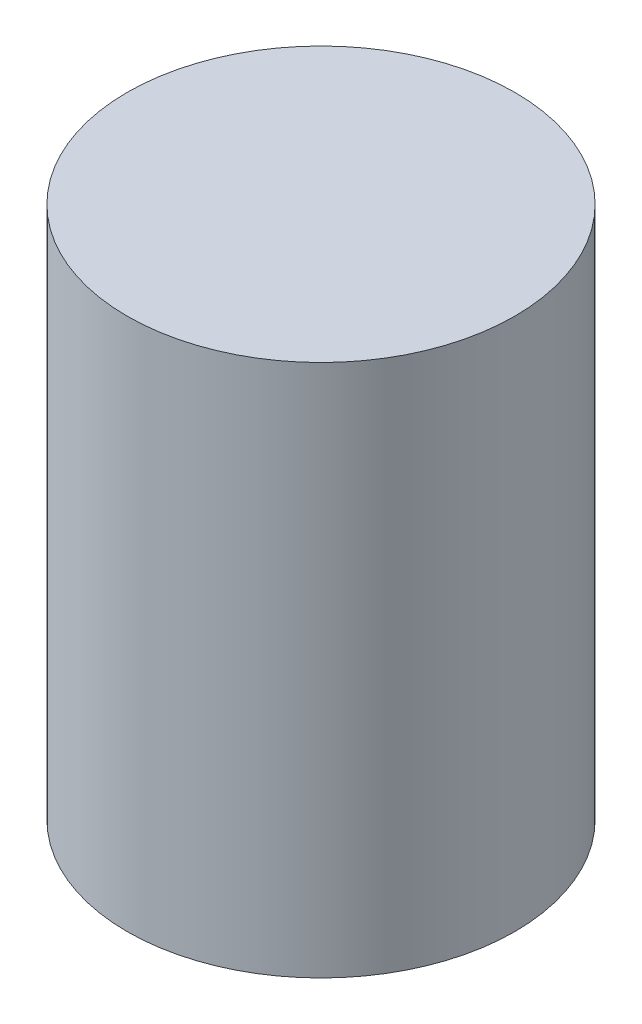
ISO-10303-21;
HEADER;
FILE_DESCRIPTION(('STEP AP214'),'2;1');
FILE_NAME('part.step','',(''),(''),'','','');
FILE_SCHEMA(('AUTOMOTIVE_DESIGN { 1 0 10303 214 1 1 1 1 }'));
ENDSEC;
DATA;
#1=APPLICATION_CONTEXT('core data for automotive mechanical design processes');
#2=APPLICATION_PROTOCOL_DEFINITION('international standard','automotive_design',2000,#1);
#3=PRODUCT_CONTEXT('',#1,'mechanical');
#4=PRODUCT('Part','Part','',(#3));
#5=PRODUCT_RELATED_PRODUCT_CATEGORY('part','',(#4));
#6=PRODUCT_DEFINITION_FORMATION('','',#4);
#7=PRODUCT_DEFINITION_CONTEXT('part definition',#1,'design');
#8=PRODUCT_DEFINITION('design','',#6,#7);
#9=PRODUCT_DEFINITION_SHAPE('','',#8);
#10=(LENGTH_UNIT() NAMED_UNIT(*) SI_UNIT(.MILLI.,.METRE.));
#11=(NAMED_UNIT(*) PLANE_ANGLE_UNIT() SI_UNIT($,.RADIAN.));
#12=(NAMED_UNIT(*) SI_UNIT($,.STERADIAN.) SOLID_ANGLE_UNIT());
#13=UNCERTAINTY_MEASURE_WITH_UNIT(LENGTH_MEASURE(1.E-05),#10,'distance_accuracy_value','');
#14=(GEOMETRIC_REPRESENTATION_CONTEXT(3) GLOBAL_UNCERTAINTY_ASSIGNED_CONTEXT((#13)) GLOBAL_UNIT_ASSIGNED_CONTEXT((#10,
#11,#12)) REPRESENTATION_CONTEXT('',''));
#15=CARTESIAN_POINT('',(0.,0.,0.));
#16=DIRECTION('',(0.,0.,1.));
#17=DIRECTION('',(1.,0.,0.));
#18=AXIS2_PLACEMENT_3D('',#15,#16,#17);
#19=CARTESIAN_POINT('',(0.,49.5,0.));
#20=DIRECTION('',(0.,-1.,0.));
#21=DIRECTION('',(0.,0.,-1.));
#22=AXIS2_PLACEMENT_3D('',#19,#20,#21);
#23=CYLINDRICAL_SURFACE('',#22,18.);
#24=CARTESIAN_POINT('',(0.,49.5,0.));
#25=DIRECTION('',(0.,1.,0.));
#26=DIRECTION('',(0.,0.,1.));
#27=AXIS2_PLACEMENT_3D('',#24,#25,#26);
#28=CIRCLE('',#27,18.);
#29=CARTESIAN_POINT('',(0.,49.5,18.));
#30=VERTEX_POINT('',#29);
#31=EDGE_CURVE('E10',#30,#30,#28,.T.);
#32=ORIENTED_EDGE('',*,*,#31,.F.);
#33=EDGE_LOOP('',(#32));
#34=FACE_BOUND('',#33,.T.);
#35=CARTESIAN_POINT('',(0.,0.,0.));
#36=DIRECTION('',(0.,1.,0.));
#37=DIRECTION('',(0.,0.,1.));
#38=AXIS2_PLACEMENT_3D('',#35,#36,#37);
#39=CIRCLE('',#38,18.);
#40=CARTESIAN_POINT('',(0.,0.,18.));
#41=VERTEX_POINT('',#40);
#42=EDGE_CURVE('E41',#41,#41,#39,.T.);
#43=ORIENTED_EDGE('',*,*,#42,.T.);
#44=EDGE_LOOP('',(#43));
#45=FACE_BOUND('',#44,.T.);
#46=ADVANCED_FACE('F38',(#34,#45),#23,.T.);
#47=CARTESIAN_POINT('',(0.,49.5,0.));
#48=DIRECTION('',(0.,1.,0.));
#49=DIRECTION('',(0.,0.,1.));
#50=AXIS2_PLACEMENT_3D('',#47,#48,#49);
#51=PLANE('',#50);
#52=ORIENTED_EDGE('',*,*,#31,.T.);
#53=EDGE_LOOP('',(#52));
#54=FACE_BOUND('',#53,.T.);
#55=ADVANCED_FACE('F53',(#54),#51,.T.);
#56=CARTESIAN_POINT('',(0.,0.,0.));
#57=DIRECTION('',(0.,1.,0.));
#58=DIRECTION('',(0.,0.,1.));
#59=AXIS2_PLACEMENT_3D('',#56,#57,#58);
#60=PLANE('',#59);
#61=ORIENTED_EDGE('',*,*,#42,.F.);
#62=EDGE_LOOP('',(#61));
#63=FACE_BOUND('',#62,.T.);
#64=ADVANCED_FACE('F51',(#63),#60,.F.);
#65=CLOSED_SHELL('',(#46,#55,#64));
#66=MANIFOLD_SOLID_BREP('B2',#65);
#67=ADVANCED_BREP_SHAPE_REPRESENTATION('',(#18,#66),#14);
#68=SHAPE_DEFINITION_REPRESENTATION(#9,#67);
ENDSEC;
END-ISO-10303-21;
